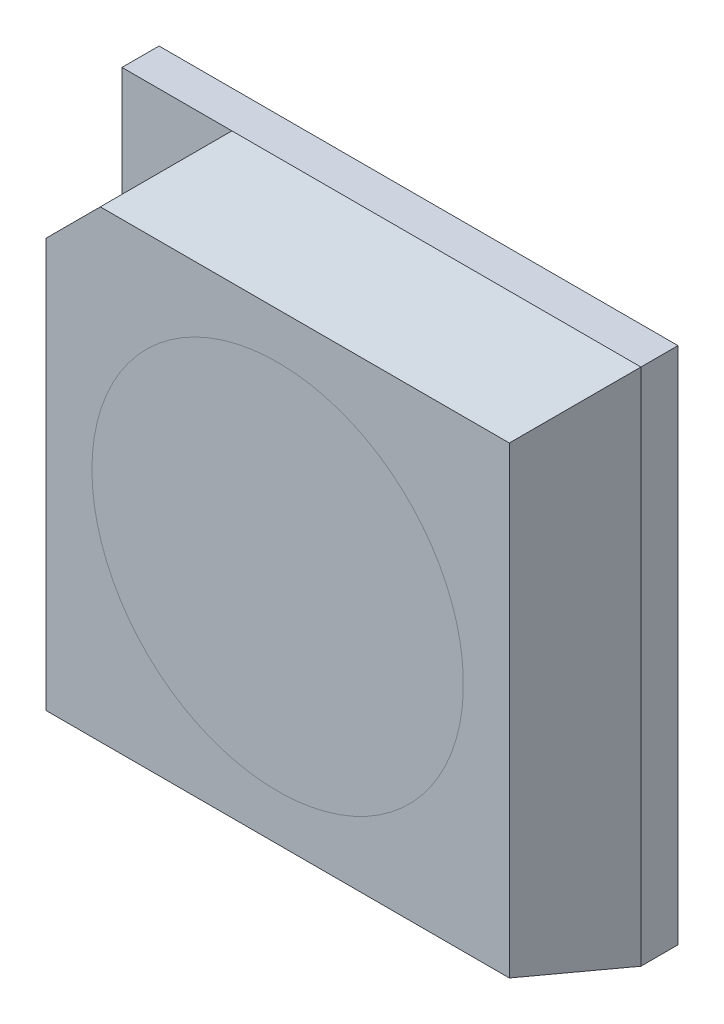
ISO-10303-21;
HEADER;
FILE_DESCRIPTION(('STEP AP214'),'2;1');
FILE_NAME('part.step','',(''),(''),'','','');
FILE_SCHEMA(('AUTOMOTIVE_DESIGN { 1 0 10303 214 1 1 1 1 }'));
ENDSEC;
DATA;
#1=APPLICATION_CONTEXT('core data for automotive mechanical design processes');
#2=APPLICATION_PROTOCOL_DEFINITION('international standard','automotive_design',2000,#1);
#3=PRODUCT_CONTEXT('',#1,'mechanical');
#4=PRODUCT('Part','Part','',(#3));
#5=PRODUCT_RELATED_PRODUCT_CATEGORY('part','',(#4));
#6=PRODUCT_DEFINITION_FORMATION('','',#4);
#7=PRODUCT_DEFINITION_CONTEXT('part definition',#1,'design');
#8=PRODUCT_DEFINITION('design','',#6,#7);
#9=PRODUCT_DEFINITION_SHAPE('','',#8);
#10=(LENGTH_UNIT() NAMED_UNIT(*) SI_UNIT(.MILLI.,.METRE.));
#11=(NAMED_UNIT(*) PLANE_ANGLE_UNIT() SI_UNIT($,.RADIAN.));
#12=(NAMED_UNIT(*) SI_UNIT($,.STERADIAN.) SOLID_ANGLE_UNIT());
#13=UNCERTAINTY_MEASURE_WITH_UNIT(LENGTH_MEASURE(1.E-05),#10,'distance_accuracy_value','');
#14=(GEOMETRIC_REPRESENTATION_CONTEXT(3) GLOBAL_UNCERTAINTY_ASSIGNED_CONTEXT((#13)) GLOBAL_UNIT_ASSIGNED_CONTEXT((#10,
#11,#12)) REPRESENTATION_CONTEXT('',''));
#15=CARTESIAN_POINT('',(0.,0.,0.));
#16=DIRECTION('',(0.,0.,1.));
#17=DIRECTION('',(1.,0.,0.));
#18=AXIS2_PLACEMENT_3D('',#15,#16,#17);
#19=CARTESIAN_POINT('',(0.566536214961577,0.166197507041943,0.25));
#20=DIRECTION('',(0.,0.,-1.));
#21=DIRECTION('',(-1.,0.,0.));
#22=AXIS2_PLACEMENT_3D('',#19,#20,#21);
#23=CYLINDRICAL_SURFACE('',#22,0.295340450420934);
#24=CARTESIAN_POINT('',(0.566536214961577,0.166197507041943,0.25));
#25=DIRECTION('',(0.,0.,1.));
#26=DIRECTION('',(1.,0.,0.));
#27=AXIS2_PLACEMENT_3D('',#24,#25,#26);
#28=CIRCLE('',#27,0.295340450420934);
#29=CARTESIAN_POINT('',(0.861876665382511,0.166197507041943,0.25));
#30=VERTEX_POINT('',#29);
#31=EDGE_CURVE('E13',#30,#30,#28,.T.);
#32=ORIENTED_EDGE('',*,*,#31,.F.);
#33=EDGE_LOOP('',(#32));
#34=FACE_BOUND('',#33,.T.);
#35=CARTESIAN_POINT('',(0.566536214961577,0.166197507041943,0.));
#36=DIRECTION('',(0.,0.,1.));
#37=DIRECTION('',(1.,0.,0.));
#38=AXIS2_PLACEMENT_3D('',#35,#36,#37);
#39=CIRCLE('',#38,0.295340450420934);
#40=CARTESIAN_POINT('',(0.861876665382511,0.166197507041943,0.));
#41=VERTEX_POINT('',#40);
#42=EDGE_CURVE('E259',#41,#41,#39,.T.);
#43=ORIENTED_EDGE('',*,*,#42,.T.);
#44=EDGE_LOOP('',(#43));
#45=FACE_BOUND('',#44,.T.);
#46=ADVANCED_FACE('F256',(#34,#45),#23,.T.);
#47=CARTESIAN_POINT('',(0.,0.,0.25));
#48=DIRECTION('',(0.,0.,1.));
#49=DIRECTION('',(1.,0.,0.));
#50=AXIS2_PLACEMENT_3D('',#47,#48,#49);
#51=PLANE('',#50);
#52=ORIENTED_EDGE('',*,*,#31,.T.);
#53=EDGE_LOOP('',(#52));
#54=FACE_BOUND('',#53,.T.);
#55=ADVANCED_FACE('F273',(#54),#51,.T.);
#56=CARTESIAN_POINT('',(0.,0.,0.));
#57=DIRECTION('',(0.,0.,1.));
#58=DIRECTION('',(1.,0.,0.));
#59=AXIS2_PLACEMENT_3D('',#56,#57,#58);
#60=PLANE('',#59);
#61=ORIENTED_EDGE('',*,*,#42,.F.);
#62=EDGE_LOOP('',(#61));
#63=FACE_BOUND('',#62,.T.);
#64=ADVANCED_FACE('F271',(#63),#60,.F.);
#65=CLOSED_SHELL('',(#46,#55,#64));
#66=MANIFOLD_SOLID_BREP('B2',#65);
#67=CARTESIAN_POINT('',(-0.428114095825549,-0.428013866610399,0.25));
#68=DIRECTION('',(0.,0.,-1.));
#69=DIRECTION('',(-1.,0.,0.));
#70=AXIS2_PLACEMENT_3D('',#67,#68,#69);
#71=CYLINDRICAL_SURFACE('',#70,0.338833711083453);
#72=CARTESIAN_POINT('',(-0.428114095825549,-0.428013866610399,0.25));
#73=DIRECTION('',(0.,0.,1.));
#74=DIRECTION('',(1.,0.,0.));
#75=AXIS2_PLACEMENT_3D('',#72,#73,#74);
#76=CIRCLE('',#75,0.338833711083453);
#77=CARTESIAN_POINT('',(-0.0892803847420964,-0.428013866610399,0.25));
#78=VERTEX_POINT('',#77);
#79=EDGE_CURVE('E255',#78,#78,#76,.T.);
#80=ORIENTED_EDGE('',*,*,#79,.F.);
#81=EDGE_LOOP('',(#80));
#82=FACE_BOUND('',#81,.T.);
#83=CARTESIAN_POINT('',(-0.428114095825549,-0.428013866610399,0.));
#84=DIRECTION('',(0.,0.,1.));
#85=DIRECTION('',(1.,0.,0.));
#86=AXIS2_PLACEMENT_3D('',#83,#84,#85);
#87=CIRCLE('',#86,0.338833711083453);
#88=CARTESIAN_POINT('',(-0.0892803847420964,-0.428013866610399,0.));
#89=VERTEX_POINT('',#88);
#90=EDGE_CURVE('E317',#89,#89,#87,.T.);
#91=ORIENTED_EDGE('',*,*,#90,.T.);
#92=EDGE_LOOP('',(#91));
#93=FACE_BOUND('',#92,.T.);
#94=ADVANCED_FACE('F314',(#82,#93),#71,.T.);
#95=CARTESIAN_POINT('',(0.,0.,0.25));
#96=DIRECTION('',(0.,0.,1.));
#97=DIRECTION('',(1.,0.,0.));
#98=AXIS2_PLACEMENT_3D('',#95,#96,#97);
#99=PLANE('',#98);
#100=ORIENTED_EDGE('',*,*,#79,.T.);
#101=EDGE_LOOP('',(#100));
#102=FACE_BOUND('',#101,.T.);
#103=ADVANCED_FACE('F331',(#102),#99,.T.);
#104=CARTESIAN_POINT('',(0.,0.,0.));
#105=DIRECTION('',(0.,0.,1.));
#106=DIRECTION('',(1.,0.,0.));
#107=AXIS2_PLACEMENT_3D('',#104,#105,#106);
#108=PLANE('',#107);
#109=ORIENTED_EDGE('',*,*,#90,.F.);
#110=EDGE_LOOP('',(#109));
#111=FACE_BOUND('',#110,.T.);
#112=ADVANCED_FACE('F329',(#111),#108,.F.);
#113=CLOSED_SHELL('',(#94,#103,#112));
#114=MANIFOLD_SOLID_BREP('B8',#113);
#115=CARTESIAN_POINT('',(-0.483693502486958,0.600735588307089,0.25));
#116=DIRECTION('',(0.,0.,-1.));
#117=DIRECTION('',(-1.,0.,0.));
#118=AXIS2_PLACEMENT_3D('',#115,#116,#117);
#119=CYLINDRICAL_SURFACE('',#118,0.240285244372317);
#120=CARTESIAN_POINT('',(-0.483693502486958,0.600735588307089,0.25));
#121=DIRECTION('',(0.,0.,1.));
#122=DIRECTION('',(1.,0.,0.));
#123=AXIS2_PLACEMENT_3D('',#120,#121,#122);
#124=CIRCLE('',#123,0.240285244372317);
#125=CARTESIAN_POINT('',(-0.243408258114641,0.600735588307089,0.25));
#126=VERTEX_POINT('',#125);
#127=EDGE_CURVE('E313',#126,#126,#124,.T.);
#128=ORIENTED_EDGE('',*,*,#127,.F.);
#129=EDGE_LOOP('',(#128));
#130=FACE_BOUND('',#129,.T.);
#131=CARTESIAN_POINT('',(-0.483693502486958,0.600735588307089,0.));
#132=DIRECTION('',(0.,0.,1.));
#133=DIRECTION('',(1.,0.,0.));
#134=AXIS2_PLACEMENT_3D('',#131,#132,#133);
#135=CIRCLE('',#134,0.240285244372317);
#136=CARTESIAN_POINT('',(-0.243408258114641,0.600735588307089,0.));
#137=VERTEX_POINT('',#136);
#138=EDGE_CURVE('E377',#137,#137,#135,.T.);
#139=ORIENTED_EDGE('',*,*,#138,.T.);
#140=EDGE_LOOP('',(#139));
#141=FACE_BOUND('',#140,.T.);
#142=ADVANCED_FACE('F374',(#130,#141),#119,.T.);
#143=CARTESIAN_POINT('',(0.,0.,0.25));
#144=DIRECTION('',(0.,0.,1.));
#145=DIRECTION('',(1.,0.,0.));
#146=AXIS2_PLACEMENT_3D('',#143,#144,#145);
#147=PLANE('',#146);
#148=ORIENTED_EDGE('',*,*,#127,.T.);
#149=EDGE_LOOP('',(#148));
#150=FACE_BOUND('',#149,.T.);
#151=ADVANCED_FACE('F391',(#150),#147,.T.);
#152=CARTESIAN_POINT('',(0.,0.,0.));
#153=DIRECTION('',(0.,0.,1.));
#154=DIRECTION('',(1.,0.,0.));
#155=AXIS2_PLACEMENT_3D('',#152,#153,#154);
#156=PLANE('',#155);
#157=ORIENTED_EDGE('',*,*,#138,.F.);
#158=EDGE_LOOP('',(#157));
#159=FACE_BOUND('',#158,.T.);
#160=ADVANCED_FACE('F389',(#159),#156,.F.);
#161=CLOSED_SHELL('',(#142,#151,#160));
#162=MANIFOLD_SOLID_BREP('B250',#161);
#163=CARTESIAN_POINT('',(1.36773941373576,0.,0.25));
#164=DIRECTION('',(-1.,0.,0.));
#165=DIRECTION('',(0.,-1.,0.));
#166=AXIS2_PLACEMENT_3D('',#163,#164,#165);
#167=PLANE('',#166);
#168=DIRECTION('',(0.,1.,0.));
#169=VECTOR('',#168,1.);
#170=CARTESIAN_POINT('',(1.36773941373576,0.,0.));
#171=LINE('',#170,#169);
#172=CARTESIAN_POINT('',(1.36773941373576,-0.566536214961578,0.));
#173=VERTEX_POINT('',#172);
#174=CARTESIAN_POINT('',(1.36773941373576,0.566536214961577,0.));
#175=VERTEX_POINT('',#174);
#176=EDGE_CURVE('E620',#173,#175,#171,.T.);
#177=ORIENTED_EDGE('',*,*,#176,.T.);
#178=DIRECTION('',(0.,0.,-1.));
#179=VECTOR('',#178,1.);
#180=CARTESIAN_POINT('',(1.36773941373576,0.566536214961577,0.25));
#181=LINE('',#180,#179);
#182=CARTESIAN_POINT('',(1.36773941373576,0.566536214961577,0.25));
#183=VERTEX_POINT('',#182);
#184=EDGE_CURVE('E372',#183,#175,#181,.T.);
#185=ORIENTED_EDGE('',*,*,#184,.F.);
#186=DIRECTION('',(0.,1.,0.));
#187=VECTOR('',#186,1.);
#188=CARTESIAN_POINT('',(1.36773941373576,0.,0.25));
#189=LINE('',#188,#187);
#190=CARTESIAN_POINT('',(1.36773941373576,-0.566536214961578,0.25));
#191=VERTEX_POINT('',#190);
#192=EDGE_CURVE('E726',#191,#183,#189,.T.);
#193=ORIENTED_EDGE('',*,*,#192,.F.);
#194=DIRECTION('',(0.,0.,-1.));
#195=VECTOR('',#194,1.);
#196=CARTESIAN_POINT('',(1.36773941373576,-0.566536214961578,0.25));
#197=LINE('',#196,#195);
#198=EDGE_CURVE('E643',#191,#173,#197,.T.);
#199=ORIENTED_EDGE('',*,*,#198,.T.);
#200=EDGE_LOOP('',(#177,#185,#193,#199));
#201=FACE_BOUND('',#200,.T.);
#202=ADVANCED_FACE('F434',(#201),#167,.F.);
#203=CARTESIAN_POINT('',(0.967137814348668,0.967137814348668,0.25));
#204=DIRECTION('',(-0.707106781186547,-0.707106781186548,0.));
#205=DIRECTION('',(0.707106781186548,-0.707106781186547,0.));
#206=AXIS2_PLACEMENT_3D('',#203,#204,#205);
#207=PLANE('',#206);
#208=DIRECTION('',(-0.707106781186548,0.707106781186547,0.));
#209=VECTOR('',#208,1.);
#210=CARTESIAN_POINT('',(0.967137814348668,0.967137814348668,0.));
#211=LINE('',#210,#209);
#212=CARTESIAN_POINT('',(0.566536214961577,1.36773941373576,0.));
#213=VERTEX_POINT('',#212);
#214=EDGE_CURVE('E624',#175,#213,#211,.T.);
#215=ORIENTED_EDGE('',*,*,#214,.T.);
#216=DIRECTION('',(0.,0.,-1.));
#217=VECTOR('',#216,1.);
#218=CARTESIAN_POINT('',(0.566536214961577,1.36773941373576,0.25));
#219=LINE('',#218,#217);
#220=CARTESIAN_POINT('',(0.566536214961577,1.36773941373576,0.25));
#221=VERTEX_POINT('',#220);
#222=EDGE_CURVE('E445',#221,#213,#219,.T.);
#223=ORIENTED_EDGE('',*,*,#222,.F.);
#224=DIRECTION('',(-0.707106781186548,0.707106781186547,0.));
#225=VECTOR('',#224,1.);
#226=CARTESIAN_POINT('',(0.967137814348668,0.967137814348668,0.25));
#227=LINE('',#226,#225);
#228=EDGE_CURVE('E728',#183,#221,#227,.T.);
#229=ORIENTED_EDGE('',*,*,#228,.F.);
#230=ORIENTED_EDGE('',*,*,#184,.T.);
#231=EDGE_LOOP('',(#215,#223,#229,#230));
#232=FACE_BOUND('',#231,.T.);
#233=ADVANCED_FACE('F767',(#232),#207,.F.);
#234=CARTESIAN_POINT('',(0.,1.36773941373576,0.25));
#235=DIRECTION('',(0.,-1.,0.));
#236=DIRECTION('',(0.,0.,-1.));
#237=AXIS2_PLACEMENT_3D('',#234,#235,#236);
#238=PLANE('',#237);
#239=DIRECTION('',(-1.,0.,0.));
#240=VECTOR('',#239,1.);
#241=CARTESIAN_POINT('',(0.,1.36773941373576,0.));
#242=LINE('',#241,#240);
#243=CARTESIAN_POINT('',(-0.566536214961578,1.36773941373576,0.));
#244=VERTEX_POINT('',#243);
#245=EDGE_CURVE('E627',#213,#244,#242,.T.);
#246=ORIENTED_EDGE('',*,*,#245,.T.);
#247=DIRECTION('',(0.,0.,-1.));
#248=VECTOR('',#247,1.);
#249=CARTESIAN_POINT('',(-0.566536214961578,1.36773941373576,0.25));
#250=LINE('',#249,#248);
#251=CARTESIAN_POINT('',(-0.566536214961578,1.36773941373576,0.25));
#252=VERTEX_POINT('',#251);
#253=EDGE_CURVE('E654',#252,#244,#250,.T.);
#254=ORIENTED_EDGE('',*,*,#253,.F.);
#255=DIRECTION('',(-1.,0.,0.));
#256=VECTOR('',#255,1.);
#257=CARTESIAN_POINT('',(0.,1.36773941373576,0.25));
#258=LINE('',#257,#256);
#259=EDGE_CURVE('E731',#221,#252,#258,.T.);
#260=ORIENTED_EDGE('',*,*,#259,.F.);
#261=ORIENTED_EDGE('',*,*,#222,.T.);
#262=EDGE_LOOP('',(#246,#254,#260,#261));
#263=FACE_BOUND('',#262,.T.);
#264=ADVANCED_FACE('F772',(#263),#238,.F.);
#265=CARTESIAN_POINT('',(-0.967137814348668,0.967137814348668,0.25));
#266=DIRECTION('',(0.707106781186548,-0.707106781186547,0.));
#267=DIRECTION('',(0.707106781186547,0.707106781186548,0.));
#268=AXIS2_PLACEMENT_3D('',#265,#266,#267);
#269=PLANE('',#268);
#270=DIRECTION('',(-0.707106781186547,-0.707106781186548,0.));
#271=VECTOR('',#270,1.);
#272=CARTESIAN_POINT('',(-0.967137814348668,0.967137814348668,0.));
#273=LINE('',#272,#271);
#274=CARTESIAN_POINT('',(-1.36773941373576,0.566536214961577,0.));
#275=VERTEX_POINT('',#274);
#276=EDGE_CURVE('E630',#244,#275,#273,.T.);
#277=ORIENTED_EDGE('',*,*,#276,.T.);
#278=DIRECTION('',(0.,0.,-1.));
#279=VECTOR('',#278,1.);
#280=CARTESIAN_POINT('',(-1.36773941373576,0.566536214961577,0.25));
#281=LINE('',#280,#279);
#282=CARTESIAN_POINT('',(-1.36773941373576,0.566536214961577,0.25));
#283=VERTEX_POINT('',#282);
#284=EDGE_CURVE('E650',#283,#275,#281,.T.);
#285=ORIENTED_EDGE('',*,*,#284,.F.);
#286=DIRECTION('',(-0.707106781186547,-0.707106781186548,0.));
#287=VECTOR('',#286,1.);
#288=CARTESIAN_POINT('',(-0.967137814348668,0.967137814348668,0.25));
#289=LINE('',#288,#287);
#290=EDGE_CURVE('E734',#252,#283,#289,.T.);
#291=ORIENTED_EDGE('',*,*,#290,.F.);
#292=ORIENTED_EDGE('',*,*,#253,.T.);
#293=EDGE_LOOP('',(#277,#285,#291,#292));
#294=FACE_BOUND('',#293,.T.);
#295=ADVANCED_FACE('F742',(#294),#269,.F.);
#296=CARTESIAN_POINT('',(-1.36773941373576,0.,0.25));
#297=DIRECTION('',(1.,0.,0.));
#298=DIRECTION('',(0.,1.,0.));
#299=AXIS2_PLACEMENT_3D('',#296,#297,#298);
#300=PLANE('',#299);
#301=DIRECTION('',(0.,-1.,0.));
#302=VECTOR('',#301,1.);
#303=CARTESIAN_POINT('',(-1.36773941373576,0.,0.));
#304=LINE('',#303,#302);
#305=CARTESIAN_POINT('',(-1.36773941373576,-0.566536214961578,0.));
#306=VERTEX_POINT('',#305);
#307=EDGE_CURVE('E633',#275,#306,#304,.T.);
#308=ORIENTED_EDGE('',*,*,#307,.T.);
#309=DIRECTION('',(0.,0.,-1.));
#310=VECTOR('',#309,1.);
#311=CARTESIAN_POINT('',(-1.36773941373576,-0.566536214961578,0.25));
#312=LINE('',#311,#310);
#313=CARTESIAN_POINT('',(-1.36773941373576,-0.566536214961578,0.25));
#314=VERTEX_POINT('',#313);
#315=EDGE_CURVE('E576',#314,#306,#312,.T.);
#316=ORIENTED_EDGE('',*,*,#315,.F.);
#317=DIRECTION('',(0.,-1.,0.));
#318=VECTOR('',#317,1.);
#319=CARTESIAN_POINT('',(-1.36773941373576,0.,0.25));
#320=LINE('',#319,#318);
#321=EDGE_CURVE('E565',#283,#314,#320,.T.);
#322=ORIENTED_EDGE('',*,*,#321,.F.);
#323=ORIENTED_EDGE('',*,*,#284,.T.);
#324=EDGE_LOOP('',(#308,#316,#322,#323));
#325=FACE_BOUND('',#324,.T.);
#326=ADVANCED_FACE('F746',(#325),#300,.F.);
#327=CARTESIAN_POINT('',(-0.967137814348668,-0.967137814348668,0.25));
#328=DIRECTION('',(0.707106781186547,0.707106781186548,0.));
#329=DIRECTION('',(-0.707106781186548,0.707106781186547,0.));
#330=AXIS2_PLACEMENT_3D('',#327,#328,#329);
#331=PLANE('',#330);
#332=DIRECTION('',(0.707106781186548,-0.707106781186547,0.));
#333=VECTOR('',#332,1.);
#334=CARTESIAN_POINT('',(-0.967137814348668,-0.967137814348668,0.));
#335=LINE('',#334,#333);
#336=CARTESIAN_POINT('',(-0.566536214961576,-1.36773941373576,0.));
#337=VERTEX_POINT('',#336);
#338=EDGE_CURVE('E574',#306,#337,#335,.T.);
#339=ORIENTED_EDGE('',*,*,#338,.T.);
#340=DIRECTION('',(0.,0.,-1.));
#341=VECTOR('',#340,1.);
#342=CARTESIAN_POINT('',(-0.566536214961576,-1.36773941373576,0.25));
#343=LINE('',#342,#341);
#344=CARTESIAN_POINT('',(-0.566536214961576,-1.36773941373576,0.25));
#345=VERTEX_POINT('',#344);
#346=EDGE_CURVE('E571',#345,#337,#343,.T.);
#347=ORIENTED_EDGE('',*,*,#346,.F.);
#348=DIRECTION('',(0.707106781186548,-0.707106781186547,0.));
#349=VECTOR('',#348,1.);
#350=CARTESIAN_POINT('',(-0.967137814348668,-0.967137814348668,0.25));
#351=LINE('',#350,#349);
#352=EDGE_CURVE('E559',#314,#345,#351,.T.);
#353=ORIENTED_EDGE('',*,*,#352,.F.);
#354=ORIENTED_EDGE('',*,*,#315,.T.);
#355=EDGE_LOOP('',(#339,#347,#353,#354));
#356=FACE_BOUND('',#355,.T.);
#357=ADVANCED_FACE('F572',(#356),#331,.F.);
#358=CARTESIAN_POINT('',(0.,-1.36773941373576,0.25));
#359=DIRECTION('',(0.,1.,0.));
#360=DIRECTION('',(-1.,0.,0.));
#361=AXIS2_PLACEMENT_3D('',#358,#359,#360);
#362=PLANE('',#361);
#363=DIRECTION('',(1.,0.,0.));
#364=VECTOR('',#363,1.);
#365=CARTESIAN_POINT('',(0.,-1.36773941373576,0.));
#366=LINE('',#365,#364);
#367=CARTESIAN_POINT('',(0.566536214961578,-1.36773941373576,0.));
#368=VERTEX_POINT('',#367);
#369=EDGE_CURVE('E507',#337,#368,#366,.T.);
#370=ORIENTED_EDGE('',*,*,#369,.T.);
#371=DIRECTION('',(0.,0.,-1.));
#372=VECTOR('',#371,1.);
#373=CARTESIAN_POINT('',(0.566536214961578,-1.36773941373576,0.25));
#374=LINE('',#373,#372);
#375=CARTESIAN_POINT('',(0.566536214961578,-1.36773941373576,0.25));
#376=VERTEX_POINT('',#375);
#377=EDGE_CURVE('E577',#376,#368,#374,.T.);
#378=ORIENTED_EDGE('',*,*,#377,.F.);
#379=DIRECTION('',(1.,0.,0.));
#380=VECTOR('',#379,1.);
#381=CARTESIAN_POINT('',(0.,-1.36773941373576,0.25));
#382=LINE('',#381,#380);
#383=EDGE_CURVE('E563',#345,#376,#382,.T.);
#384=ORIENTED_EDGE('',*,*,#383,.F.);
#385=ORIENTED_EDGE('',*,*,#346,.T.);
#386=EDGE_LOOP('',(#370,#378,#384,#385));
#387=FACE_BOUND('',#386,.T.);
#388=ADVANCED_FACE('F579',(#387),#362,.F.);
#389=CARTESIAN_POINT('',(0.825716458111358,0.825716458111359,0.25));
#390=DIRECTION('',(-0.707106781186547,-0.707106781186548,0.));
#391=DIRECTION('',(0.707106781186548,-0.707106781186547,0.));
#392=AXIS2_PLACEMENT_3D('',#389,#390,#391);
#393=PLANE('',#392);
#394=DIRECTION('',(-0.707106781186548,0.707106781186547,0.));
#395=VECTOR('',#394,1.);
#396=CARTESIAN_POINT('',(0.825716458111358,0.825716458111359,0.));
#397=LINE('',#396,#395);
#398=CARTESIAN_POINT('',(1.16773941373576,0.483693502486958,0.));
#399=VERTEX_POINT('',#398);
#400=CARTESIAN_POINT('',(0.483693502486958,1.16773941373576,0.));
#401=VERTEX_POINT('',#400);
#402=EDGE_CURVE('E589',#399,#401,#397,.T.);
#403=ORIENTED_EDGE('',*,*,#402,.F.);
#404=DIRECTION('',(0.,0.,-1.));
#405=VECTOR('',#404,1.);
#406=CARTESIAN_POINT('',(1.16773941373576,0.483693502486958,0.25));
#407=LINE('',#406,#405);
#408=CARTESIAN_POINT('',(1.16773941373576,0.483693502486958,0.25));
#409=VERTEX_POINT('',#408);
#410=EDGE_CURVE('E438',#409,#399,#407,.T.);
#411=ORIENTED_EDGE('',*,*,#410,.F.);
#412=DIRECTION('',(-0.707106781186548,0.707106781186547,0.));
#413=VECTOR('',#412,1.);
#414=CARTESIAN_POINT('',(0.825716458111358,0.825716458111359,0.25));
#415=LINE('',#414,#413);
#416=CARTESIAN_POINT('',(0.483693502486958,1.16773941373576,0.25));
#417=VERTEX_POINT('',#416);
#418=EDGE_CURVE('E642',#409,#417,#415,.T.);
#419=ORIENTED_EDGE('',*,*,#418,.T.);
#420=DIRECTION('',(0.,0.,-1.));
#421=VECTOR('',#420,1.);
#422=CARTESIAN_POINT('',(0.483693502486958,1.16773941373576,0.25));
#423=LINE('',#422,#421);
#424=EDGE_CURVE('E585',#417,#401,#423,.T.);
#425=ORIENTED_EDGE('',*,*,#424,.T.);
#426=EDGE_LOOP('',(#403,#411,#419,#425));
#427=FACE_BOUND('',#426,.T.);
#428=ADVANCED_FACE('F436',(#427),#393,.T.);
#429=CARTESIAN_POINT('',(1.16773941373576,0.,0.25));
#430=DIRECTION('',(-1.,0.,0.));
#431=DIRECTION('',(0.,0.,1.));
#432=AXIS2_PLACEMENT_3D('',#429,#430,#431);
#433=PLANE('',#432);
#434=DIRECTION('',(0.,1.,0.));
#435=VECTOR('',#434,1.);
#436=CARTESIAN_POINT('',(1.16773941373576,0.,0.));
#437=LINE('',#436,#435);
#438=CARTESIAN_POINT('',(1.16773941373576,-0.483693502486959,0.));
#439=VERTEX_POINT('',#438);
#440=EDGE_CURVE('E593',#439,#399,#437,.T.);
#441=ORIENTED_EDGE('',*,*,#440,.F.);
#442=DIRECTION('',(0.,0.,-1.));
#443=VECTOR('',#442,1.);
#444=CARTESIAN_POINT('',(1.16773941373576,-0.483693502486959,0.25));
#445=LINE('',#444,#443);
#446=CARTESIAN_POINT('',(1.16773941373576,-0.483693502486959,0.25));
#447=VERTEX_POINT('',#446);
#448=EDGE_CURVE('E677',#447,#439,#445,.T.);
#449=ORIENTED_EDGE('',*,*,#448,.F.);
#450=DIRECTION('',(0.,1.,0.));
#451=VECTOR('',#450,1.);
#452=CARTESIAN_POINT('',(1.16773941373576,0.,0.25));
#453=LINE('',#452,#451);
#454=EDGE_CURVE('E688',#447,#409,#453,.T.);
#455=ORIENTED_EDGE('',*,*,#454,.T.);
#456=ORIENTED_EDGE('',*,*,#410,.T.);
#457=EDGE_LOOP('',(#441,#449,#455,#456));
#458=FACE_BOUND('',#457,.T.);
#459=ADVANCED_FACE('F686',(#458),#433,.T.);
#460=CARTESIAN_POINT('',(0.825716458111359,-0.825716458111359,0.25));
#461=DIRECTION('',(-0.707106781186548,0.707106781186547,0.));
#462=DIRECTION('',(-0.707106781186547,-0.707106781186548,0.));
#463=AXIS2_PLACEMENT_3D('',#460,#461,#462);
#464=PLANE('',#463);
#465=DIRECTION('',(0.707106781186547,0.707106781186548,0.));
#466=VECTOR('',#465,1.);
#467=CARTESIAN_POINT('',(0.825716458111359,-0.825716458111359,0.));
#468=LINE('',#467,#466);
#469=CARTESIAN_POINT('',(0.483693502486959,-1.16773941373576,0.));
#470=VERTEX_POINT('',#469);
#471=EDGE_CURVE('E597',#470,#439,#468,.T.);
#472=ORIENTED_EDGE('',*,*,#471,.F.);
#473=DIRECTION('',(0.,0.,-1.));
#474=VECTOR('',#473,1.);
#475=CARTESIAN_POINT('',(0.483693502486959,-1.16773941373576,0.25));
#476=LINE('',#475,#474);
#477=CARTESIAN_POINT('',(0.483693502486959,-1.16773941373576,0.25));
#478=VERTEX_POINT('',#477);
#479=EDGE_CURVE('E675',#478,#470,#476,.T.);
#480=ORIENTED_EDGE('',*,*,#479,.F.);
#481=DIRECTION('',(0.707106781186547,0.707106781186548,0.));
#482=VECTOR('',#481,1.);
#483=CARTESIAN_POINT('',(0.825716458111359,-0.825716458111359,0.25));
#484=LINE('',#483,#482);
#485=EDGE_CURVE('E696',#478,#447,#484,.T.);
#486=ORIENTED_EDGE('',*,*,#485,.T.);
#487=ORIENTED_EDGE('',*,*,#448,.T.);
#488=EDGE_LOOP('',(#472,#480,#486,#487));
#489=FACE_BOUND('',#488,.T.);
#490=ADVANCED_FACE('F694',(#489),#464,.T.);
#491=CARTESIAN_POINT('',(0.,-1.16773941373576,0.25));
#492=DIRECTION('',(0.,1.,0.));
#493=DIRECTION('',(-1.,0.,0.));
#494=AXIS2_PLACEMENT_3D('',#491,#492,#493);
#495=PLANE('',#494);
#496=DIRECTION('',(1.,0.,0.));
#497=VECTOR('',#496,1.);
#498=CARTESIAN_POINT('',(0.,-1.16773941373576,0.));
#499=LINE('',#498,#497);
#500=CARTESIAN_POINT('',(-0.483693502486958,-1.16773941373576,0.));
#501=VERTEX_POINT('',#500);
#502=EDGE_CURVE('E601',#501,#470,#499,.T.);
#503=ORIENTED_EDGE('',*,*,#502,.F.);
#504=DIRECTION('',(0.,0.,-1.));
#505=VECTOR('',#504,1.);
#506=CARTESIAN_POINT('',(-0.483693502486958,-1.16773941373576,0.25));
#507=LINE('',#506,#505);
#508=CARTESIAN_POINT('',(-0.483693502486958,-1.16773941373576,0.25));
#509=VERTEX_POINT('',#508);
#510=EDGE_CURVE('E672',#509,#501,#507,.T.);
#511=ORIENTED_EDGE('',*,*,#510,.F.);
#512=DIRECTION('',(1.,0.,0.));
#513=VECTOR('',#512,1.);
#514=CARTESIAN_POINT('',(0.,-1.16773941373576,0.25));
#515=LINE('',#514,#513);
#516=EDGE_CURVE('E702',#509,#478,#515,.T.);
#517=ORIENTED_EDGE('',*,*,#516,.T.);
#518=ORIENTED_EDGE('',*,*,#479,.T.);
#519=EDGE_LOOP('',(#503,#511,#517,#518));
#520=FACE_BOUND('',#519,.T.);
#521=ADVANCED_FACE('F706',(#520),#495,.T.);
#522=CARTESIAN_POINT('',(-0.825716458111358,-0.825716458111359,0.25));
#523=DIRECTION('',(0.707106781186547,0.707106781186548,0.));
#524=DIRECTION('',(-0.707106781186548,0.707106781186547,0.));
#525=AXIS2_PLACEMENT_3D('',#522,#523,#524);
#526=PLANE('',#525);
#527=DIRECTION('',(0.707106781186548,-0.707106781186547,0.));
#528=VECTOR('',#527,1.);
#529=CARTESIAN_POINT('',(-0.825716458111358,-0.825716458111359,0.));
#530=LINE('',#529,#528);
#531=CARTESIAN_POINT('',(-1.16773941373576,-0.483693502486959,0.));
#532=VERTEX_POINT('',#531);
#533=EDGE_CURVE('E605',#532,#501,#530,.T.);
#534=ORIENTED_EDGE('',*,*,#533,.F.);
#535=DIRECTION('',(0.,0.,-1.));
#536=VECTOR('',#535,1.);
#537=CARTESIAN_POINT('',(-1.16773941373576,-0.483693502486959,0.25));
#538=LINE('',#537,#536);
#539=CARTESIAN_POINT('',(-1.16773941373576,-0.483693502486959,0.25));
#540=VERTEX_POINT('',#539);
#541=EDGE_CURVE('E669',#540,#532,#538,.T.);
#542=ORIENTED_EDGE('',*,*,#541,.F.);
#543=DIRECTION('',(0.707106781186548,-0.707106781186547,0.));
#544=VECTOR('',#543,1.);
#545=CARTESIAN_POINT('',(-0.825716458111358,-0.825716458111359,0.25));
#546=LINE('',#545,#544);
#547=EDGE_CURVE('E708',#540,#509,#546,.T.);
#548=ORIENTED_EDGE('',*,*,#547,.T.);
#549=ORIENTED_EDGE('',*,*,#510,.T.);
#550=EDGE_LOOP('',(#534,#542,#548,#549));
#551=FACE_BOUND('',#550,.T.);
#552=ADVANCED_FACE('F783',(#551),#526,.T.);
#553=CARTESIAN_POINT('',(-1.16773941373576,0.,0.25));
#554=DIRECTION('',(1.,0.,0.));
#555=DIRECTION('',(0.,1.,0.));
#556=AXIS2_PLACEMENT_3D('',#553,#554,#555);
#557=PLANE('',#556);
#558=DIRECTION('',(0.,-1.,0.));
#559=VECTOR('',#558,1.);
#560=CARTESIAN_POINT('',(-1.16773941373576,0.,0.));
#561=LINE('',#560,#559);
#562=CARTESIAN_POINT('',(-1.16773941373576,0.483693502486957,0.));
#563=VERTEX_POINT('',#562);
#564=EDGE_CURVE('E608',#563,#532,#561,.T.);
#565=ORIENTED_EDGE('',*,*,#564,.F.);
#566=DIRECTION('',(0.,0.,-1.));
#567=VECTOR('',#566,1.);
#568=CARTESIAN_POINT('',(-1.16773941373576,0.483693502486957,0.25));
#569=LINE('',#568,#567);
#570=CARTESIAN_POINT('',(-1.16773941373576,0.483693502486957,0.25));
#571=VERTEX_POINT('',#570);
#572=EDGE_CURVE('E666',#571,#563,#569,.T.);
#573=ORIENTED_EDGE('',*,*,#572,.F.);
#574=DIRECTION('',(0.,-1.,0.));
#575=VECTOR('',#574,1.);
#576=CARTESIAN_POINT('',(-1.16773941373576,0.,0.25));
#577=LINE('',#576,#575);
#578=EDGE_CURVE('E712',#571,#540,#577,.T.);
#579=ORIENTED_EDGE('',*,*,#578,.T.);
#580=ORIENTED_EDGE('',*,*,#541,.T.);
#581=EDGE_LOOP('',(#565,#573,#579,#580));
#582=FACE_BOUND('',#581,.T.);
#583=ADVANCED_FACE('F779',(#582),#557,.T.);
#584=CARTESIAN_POINT('',(-0.825716458111359,0.825716458111358,0.25));
#585=DIRECTION('',(0.707106781186548,-0.707106781186547,0.));
#586=DIRECTION('',(0.707106781186547,0.707106781186548,0.));
#587=AXIS2_PLACEMENT_3D('',#584,#585,#586);
#588=PLANE('',#587);
#589=DIRECTION('',(-0.707106781186547,-0.707106781186548,0.));
#590=VECTOR('',#589,1.);
#591=CARTESIAN_POINT('',(-0.825716458111359,0.825716458111358,0.));
#592=LINE('',#591,#590);
#593=CARTESIAN_POINT('',(-0.483693502486958,1.16773941373576,0.));
#594=VERTEX_POINT('',#593);
#595=EDGE_CURVE('E612',#594,#563,#592,.T.);
#596=ORIENTED_EDGE('',*,*,#595,.F.);
#597=DIRECTION('',(0.,0.,-1.));
#598=VECTOR('',#597,1.);
#599=CARTESIAN_POINT('',(-0.483693502486958,1.16773941373576,0.25));
#600=LINE('',#599,#598);
#601=CARTESIAN_POINT('',(-0.483693502486958,1.16773941373576,0.25));
#602=VERTEX_POINT('',#601);
#603=EDGE_CURVE('E663',#602,#594,#600,.T.);
#604=ORIENTED_EDGE('',*,*,#603,.F.);
#605=DIRECTION('',(-0.707106781186547,-0.707106781186548,0.));
#606=VECTOR('',#605,1.);
#607=CARTESIAN_POINT('',(-0.825716458111359,0.825716458111358,0.25));
#608=LINE('',#607,#606);
#609=EDGE_CURVE('E718',#602,#571,#608,.T.);
#610=ORIENTED_EDGE('',*,*,#609,.T.);
#611=ORIENTED_EDGE('',*,*,#572,.T.);
#612=EDGE_LOOP('',(#596,#604,#610,#611));
#613=FACE_BOUND('',#612,.T.);
#614=ADVANCED_FACE('F761',(#613),#588,.T.);
#615=CARTESIAN_POINT('',(0.,1.16773941373576,0.25));
#616=DIRECTION('',(0.,-1.,0.));
#617=DIRECTION('',(0.,0.,-1.));
#618=AXIS2_PLACEMENT_3D('',#615,#616,#617);
#619=PLANE('',#618);
#620=DIRECTION('',(-1.,0.,0.));
#621=VECTOR('',#620,1.);
#622=CARTESIAN_POINT('',(0.,1.16773941373576,0.));
#623=LINE('',#622,#621);
#624=EDGE_CURVE('E616',#401,#594,#623,.T.);
#625=ORIENTED_EDGE('',*,*,#624,.F.);
#626=ORIENTED_EDGE('',*,*,#424,.F.);
#627=DIRECTION('',(-1.,0.,0.));
#628=VECTOR('',#627,1.);
#629=CARTESIAN_POINT('',(0.,1.16773941373576,0.25));
#630=LINE('',#629,#628);
#631=EDGE_CURVE('E722',#417,#602,#630,.T.);
#632=ORIENTED_EDGE('',*,*,#631,.T.);
#633=ORIENTED_EDGE('',*,*,#603,.T.);
#634=EDGE_LOOP('',(#625,#626,#632,#633));
#635=FACE_BOUND('',#634,.T.);
#636=ADVANCED_FACE('F754',(#635),#619,.T.);
#637=CARTESIAN_POINT('',(0.967137814348669,-0.967137814348668,0.25));
#638=DIRECTION('',(-0.707106781186548,0.707106781186547,0.));
#639=DIRECTION('',(-0.707106781186547,-0.707106781186548,0.));
#640=AXIS2_PLACEMENT_3D('',#637,#638,#639);
#641=PLANE('',#640);
#642=DIRECTION('',(0.707106781186547,0.707106781186548,0.));
#643=VECTOR('',#642,1.);
#644=CARTESIAN_POINT('',(0.967137814348669,-0.967137814348668,0.));
#645=LINE('',#644,#643);
#646=EDGE_CURVE('E513',#368,#173,#645,.T.);
#647=ORIENTED_EDGE('',*,*,#646,.T.);
#648=ORIENTED_EDGE('',*,*,#198,.F.);
#649=DIRECTION('',(0.707106781186547,0.707106781186548,0.));
#650=VECTOR('',#649,1.);
#651=CARTESIAN_POINT('',(0.967137814348669,-0.967137814348668,0.25));
#652=LINE('',#651,#650);
#653=EDGE_CURVE('E454',#376,#191,#652,.T.);
#654=ORIENTED_EDGE('',*,*,#653,.F.);
#655=ORIENTED_EDGE('',*,*,#377,.T.);
#656=EDGE_LOOP('',(#647,#648,#654,#655));
#657=FACE_BOUND('',#656,.T.);
#658=ADVANCED_FACE('F752',(#657),#641,.F.);
#659=CARTESIAN_POINT('',(0.,0.,0.25));
#660=DIRECTION('',(0.,0.,1.));
#661=DIRECTION('',(1.,0.,0.));
#662=AXIS2_PLACEMENT_3D('',#659,#660,#661);
#663=PLANE('',#662);
#664=ORIENTED_EDGE('',*,*,#418,.F.);
#665=ORIENTED_EDGE('',*,*,#454,.F.);
#666=ORIENTED_EDGE('',*,*,#485,.F.);
#667=ORIENTED_EDGE('',*,*,#516,.F.);
#668=ORIENTED_EDGE('',*,*,#547,.F.);
#669=ORIENTED_EDGE('',*,*,#578,.F.);
#670=ORIENTED_EDGE('',*,*,#609,.F.);
#671=ORIENTED_EDGE('',*,*,#631,.F.);
#672=EDGE_LOOP('',(#664,#665,#666,#667,#668,#669,#670,#671));
#673=FACE_BOUND('',#672,.T.);
#674=ORIENTED_EDGE('',*,*,#192,.T.);
#675=ORIENTED_EDGE('',*,*,#228,.T.);
#676=ORIENTED_EDGE('',*,*,#259,.T.);
#677=ORIENTED_EDGE('',*,*,#290,.T.);
#678=ORIENTED_EDGE('',*,*,#321,.T.);
#679=ORIENTED_EDGE('',*,*,#352,.T.);
#680=ORIENTED_EDGE('',*,*,#383,.T.);
#681=ORIENTED_EDGE('',*,*,#653,.T.);
#682=EDGE_LOOP('',(#674,#675,#676,#677,#678,#679,#680,#681));
#683=FACE_BOUND('',#682,.T.);
#684=ADVANCED_FACE('F561',(#673,#683),#663,.T.);
#685=CARTESIAN_POINT('',(0.,0.,0.));
#686=DIRECTION('',(0.,0.,1.));
#687=DIRECTION('',(1.,0.,0.));
#688=AXIS2_PLACEMENT_3D('',#685,#686,#687);
#689=PLANE('',#688);
#690=ORIENTED_EDGE('',*,*,#402,.T.);
#691=ORIENTED_EDGE('',*,*,#624,.T.);
#692=ORIENTED_EDGE('',*,*,#595,.T.);
#693=ORIENTED_EDGE('',*,*,#564,.T.);
#694=ORIENTED_EDGE('',*,*,#533,.T.);
#695=ORIENTED_EDGE('',*,*,#502,.T.);
#696=ORIENTED_EDGE('',*,*,#471,.T.);
#697=ORIENTED_EDGE('',*,*,#440,.T.);
#698=EDGE_LOOP('',(#690,#691,#692,#693,#694,#695,#696,#697));
#699=FACE_BOUND('',#698,.T.);
#700=ORIENTED_EDGE('',*,*,#176,.F.);
#701=ORIENTED_EDGE('',*,*,#646,.F.);
#702=ORIENTED_EDGE('',*,*,#369,.F.);
#703=ORIENTED_EDGE('',*,*,#338,.F.);
#704=ORIENTED_EDGE('',*,*,#307,.F.);
#705=ORIENTED_EDGE('',*,*,#276,.F.);
#706=ORIENTED_EDGE('',*,*,#245,.F.);
#707=ORIENTED_EDGE('',*,*,#214,.F.);
#708=EDGE_LOOP('',(#700,#701,#702,#703,#704,#705,#706,#707));
#709=FACE_BOUND('',#708,.T.);
#710=ADVANCED_FACE('F691',(#699,#709),#689,.F.);
#711=CLOSED_SHELL('',(#202,#233,#264,#295,#326,#357,#388,#428,#459,#490,#521,#552,#583,#614,
#636,#658,#684,#710));
#712=MANIFOLD_SOLID_BREP('B308',#711);
#713=CARTESIAN_POINT('',(0.,0.,0.7));
#714=DIRECTION('',(0.,0.,-1.));
#715=DIRECTION('',(-1.,0.,0.));
#716=AXIS2_PLACEMENT_3D('',#713,#714,#715);
#717=PLANE('',#716);
#718=CARTESIAN_POINT('',(0.,0.,0.7));
#719=DIRECTION('',(0.,0.,-1.));
#720=DIRECTION('',(-1.,0.,0.));
#721=AXIS2_PLACEMENT_3D('',#718,#719,#720);
#722=CIRCLE('',#721,1.25263344863924);
#723=CARTESIAN_POINT('',(-1.25263344863924,0.,0.7));
#724=VERTEX_POINT('',#723);
#725=EDGE_CURVE('E432',#724,#724,#722,.F.);
#726=ORIENTED_EDGE('',*,*,#725,.T.);
#727=EDGE_LOOP('',(#726));
#728=FACE_BOUND('',#727,.T.);
#729=ADVANCED_FACE('F947',(#728),#717,.F.);
#730=CARTESIAN_POINT('',(-1.75,1.75,0.));
#731=DIRECTION('',(0.,0.965925826289068,0.258819045102521));
#732=DIRECTION('',(0.,-0.258819045102521,0.965925826289068));
#733=AXIS2_PLACEMENT_3D('',#730,#731,#732);
#734=PLANE('',#733);
#735=DIRECTION('',(-0.250562807085729,-0.250562807085732,0.93511312653103));
#736=VECTOR('',#735,1.);
#737=CARTESIAN_POINT('',(-1.05511587098754,1.70345158969948,0.173721032253114));
#738=LINE('',#737,#736);
#739=CARTESIAN_POINT('',(-1.1961318953888,1.56243556529821,0.7));
#740=VERTEX_POINT('',#739);
#741=CARTESIAN_POINT('',(-1.00856746068701,1.75,0.));
#742=VERTEX_POINT('',#741);
#743=EDGE_CURVE('E963',#740,#742,#738,.F.);
#744=ORIENTED_EDGE('',*,*,#743,.F.);
#745=DIRECTION('',(1.,0.,0.));
#746=VECTOR('',#745,1.);
#747=CARTESIAN_POINT('',(0.,1.56243556529821,0.7));
#748=LINE('',#747,#746);
#749=CARTESIAN_POINT('',(1.56243556529821,1.56243556529821,0.7));
#750=VERTEX_POINT('',#749);
#751=EDGE_CURVE('E1041',#750,#740,#748,.F.);
#752=ORIENTED_EDGE('',*,*,#751,.F.);
#753=DIRECTION('',(0.250562807085732,0.250562807085732,-0.935113126531029));
#754=VECTOR('',#753,1.);
#755=CARTESIAN_POINT('',(1.53026397896861,1.53026397896861,0.820065994742155));
#756=LINE('',#755,#754);
#757=CARTESIAN_POINT('',(1.75,1.75,0.));
#758=VERTEX_POINT('',#757);
#759=EDGE_CURVE('E956',#750,#758,#756,.T.);
#760=ORIENTED_EDGE('',*,*,#759,.T.);
#761=DIRECTION('',(-1.,0.,0.));
#762=VECTOR('',#761,1.);
#763=CARTESIAN_POINT('',(-1.75,1.75,0.));
#764=LINE('',#763,#762);
#765=EDGE_CURVE('E1018',#758,#742,#764,.T.);
#766=ORIENTED_EDGE('',*,*,#765,.T.);
#767=EDGE_LOOP('',(#744,#752,#760,#766));
#768=FACE_BOUND('',#767,.T.);
#769=ADVANCED_FACE('F949',(#768),#734,.T.);
#770=CARTESIAN_POINT('',(-1.75,-1.75,0.));
#771=DIRECTION('',(-0.965925826289068,0.,0.258819045102521));
#772=DIRECTION('',(0.258819045102521,0.,0.965925826289068));
#773=AXIS2_PLACEMENT_3D('',#770,#771,#772);
#774=PLANE('',#773);
#775=DIRECTION('',(-0.250562807085732,-0.250562807085735,-0.935113126531028));
#776=VECTOR('',#775,1.);
#777=CARTESIAN_POINT('',(-1.92318761073086,0.835379849956138,-0.646344962489043));
#778=LINE('',#777,#776);
#779=CARTESIAN_POINT('',(-1.75,1.008567460687,0.));
#780=VERTEX_POINT('',#779);
#781=CARTESIAN_POINT('',(-1.56243556529821,1.19613189538879,0.7));
#782=VERTEX_POINT('',#781);
#783=EDGE_CURVE('E996',#780,#782,#778,.F.);
#784=ORIENTED_EDGE('',*,*,#783,.F.);
#785=DIRECTION('',(0.,-1.,0.));
#786=VECTOR('',#785,1.);
#787=CARTESIAN_POINT('',(-1.75,-1.75,0.));
#788=LINE('',#787,#786);
#789=CARTESIAN_POINT('',(-1.75,-1.75,0.));
#790=VERTEX_POINT('',#789);
#791=EDGE_CURVE('E1008',#780,#790,#788,.T.);
#792=ORIENTED_EDGE('',*,*,#791,.T.);
#793=DIRECTION('',(-0.250562807085732,-0.250562807085732,-0.935113126531029));
#794=VECTOR('',#793,1.);
#795=CARTESIAN_POINT('',(-1.75,-1.75,0.));
#796=LINE('',#795,#794);
#797=CARTESIAN_POINT('',(-1.56243556529821,-1.56243556529821,0.7));
#798=VERTEX_POINT('',#797);
#799=EDGE_CURVE('E1032',#798,#790,#796,.T.);
#800=ORIENTED_EDGE('',*,*,#799,.F.);
#801=DIRECTION('',(0.,1.,0.));
#802=VECTOR('',#801,1.);
#803=CARTESIAN_POINT('',(-1.56243556529821,0.,0.7));
#804=LINE('',#803,#802);
#805=EDGE_CURVE('E1010',#782,#798,#804,.F.);
#806=ORIENTED_EDGE('',*,*,#805,.F.);
#807=EDGE_LOOP('',(#784,#792,#800,#806));
#808=FACE_BOUND('',#807,.T.);
#809=ADVANCED_FACE('F1006',(#808),#774,.T.);
#810=ORIENTED_EDGE('',*,*,#725,.F.);
#811=EDGE_LOOP('',(#810));
#812=FACE_BOUND('',#811,.T.);
#813=DIRECTION('',(0.707106781186544,0.707106781186552,0.));
#814=VECTOR('',#813,1.);
#815=CARTESIAN_POINT('',(-1.75,1.008567460687,0.7));
#816=LINE('',#815,#814);
#817=EDGE_CURVE('E1002',#782,#740,#816,.T.);
#818=ORIENTED_EDGE('',*,*,#817,.F.);
#819=ORIENTED_EDGE('',*,*,#805,.T.);
#820=DIRECTION('',(-1.,0.,0.));
#821=VECTOR('',#820,1.);
#822=CARTESIAN_POINT('',(0.,-1.56243556529821,0.7));
#823=LINE('',#822,#821);
#824=CARTESIAN_POINT('',(1.56243556529821,-1.56243556529821,0.7));
#825=VERTEX_POINT('',#824);
#826=EDGE_CURVE('E971',#798,#825,#823,.F.);
#827=ORIENTED_EDGE('',*,*,#826,.T.);
#828=DIRECTION('',(0.,-1.,0.));
#829=VECTOR('',#828,1.);
#830=CARTESIAN_POINT('',(1.56243556529821,0.,0.7));
#831=LINE('',#830,#829);
#832=EDGE_CURVE('E1022',#825,#750,#831,.F.);
#833=ORIENTED_EDGE('',*,*,#832,.T.);
#834=ORIENTED_EDGE('',*,*,#751,.T.);
#835=EDGE_LOOP('',(#818,#819,#827,#833,#834));
#836=FACE_BOUND('',#835,.T.);
#837=ADVANCED_FACE('F1055',(#812,#836),#717,.F.);
#838=CARTESIAN_POINT('',(0.,0.,0.));
#839=DIRECTION('',(0.,0.,-1.));
#840=DIRECTION('',(-1.,0.,0.));
#841=AXIS2_PLACEMENT_3D('',#838,#839,#840);
#842=PLANE('',#841);
#843=ORIENTED_EDGE('',*,*,#791,.F.);
#844=DIRECTION('',(0.707106781186544,0.707106781186552,0.));
#845=VECTOR('',#844,1.);
#846=CARTESIAN_POINT('',(-1.75,1.008567460687,0.));
#847=LINE('',#846,#845);
#848=EDGE_CURVE('E993',#780,#742,#847,.T.);
#849=ORIENTED_EDGE('',*,*,#848,.T.);
#850=ORIENTED_EDGE('',*,*,#765,.F.);
#851=DIRECTION('',(0.,1.,0.));
#852=VECTOR('',#851,1.);
#853=CARTESIAN_POINT('',(1.75,-1.75,0.));
#854=LINE('',#853,#852);
#855=CARTESIAN_POINT('',(1.75,-1.75,0.));
#856=VERTEX_POINT('',#855);
#857=EDGE_CURVE('E1025',#856,#758,#854,.T.);
#858=ORIENTED_EDGE('',*,*,#857,.F.);
#859=DIRECTION('',(1.,0.,0.));
#860=VECTOR('',#859,1.);
#861=CARTESIAN_POINT('',(-1.75,-1.75,0.));
#862=LINE('',#861,#860);
#863=EDGE_CURVE('E1016',#790,#856,#862,.T.);
#864=ORIENTED_EDGE('',*,*,#863,.F.);
#865=EDGE_LOOP('',(#843,#849,#850,#858,#864));
#866=FACE_BOUND('',#865,.T.);
#867=ADVANCED_FACE('F1014',(#866),#842,.T.);
#868=CARTESIAN_POINT('',(1.75,-1.75,0.));
#869=DIRECTION('',(0.965925826289068,0.,0.258819045102521));
#870=DIRECTION('',(0.258819045102521,0.,-0.965925826289068));
#871=AXIS2_PLACEMENT_3D('',#868,#869,#870);
#872=PLANE('',#871);
#873=ORIENTED_EDGE('',*,*,#857,.T.);
#874=ORIENTED_EDGE('',*,*,#759,.F.);
#875=ORIENTED_EDGE('',*,*,#832,.F.);
#876=DIRECTION('',(0.250562807085732,-0.250562807085732,-0.935113126531029));
#877=VECTOR('',#876,1.);
#878=CARTESIAN_POINT('',(1.75,-1.75,0.));
#879=LINE('',#878,#877);
#880=EDGE_CURVE('E1033',#825,#856,#879,.T.);
#881=ORIENTED_EDGE('',*,*,#880,.T.);
#882=EDGE_LOOP('',(#873,#874,#875,#881));
#883=FACE_BOUND('',#882,.T.);
#884=ADVANCED_FACE('F1057',(#883),#872,.T.);
#885=CARTESIAN_POINT('',(-1.75,-1.75,0.));
#886=DIRECTION('',(0.,-0.965925826289068,0.258819045102521));
#887=DIRECTION('',(0.,-0.258819045102521,-0.965925826289068));
#888=AXIS2_PLACEMENT_3D('',#885,#886,#887);
#889=PLANE('',#888);
#890=ORIENTED_EDGE('',*,*,#863,.T.);
#891=ORIENTED_EDGE('',*,*,#880,.F.);
#892=ORIENTED_EDGE('',*,*,#826,.F.);
#893=ORIENTED_EDGE('',*,*,#799,.T.);
#894=EDGE_LOOP('',(#890,#891,#892,#893));
#895=FACE_BOUND('',#894,.T.);
#896=ADVANCED_FACE('F1059',(#895),#889,.T.);
#897=CARTESIAN_POINT('',(-1.75,1.008567460687,0.7));
#898=DIRECTION('',(-0.707106781186552,0.707106781186543,0.));
#899=DIRECTION('',(-0.707106781186543,-0.707106781186552,0.));
#900=AXIS2_PLACEMENT_3D('',#897,#898,#899);
#901=PLANE('',#900);
#902=ORIENTED_EDGE('',*,*,#743,.T.);
#903=ORIENTED_EDGE('',*,*,#848,.F.);
#904=ORIENTED_EDGE('',*,*,#783,.T.);
#905=ORIENTED_EDGE('',*,*,#817,.T.);
#906=EDGE_LOOP('',(#902,#903,#904,#905));
#907=FACE_BOUND('',#906,.T.);
#908=ADVANCED_FACE('F995',(#907),#901,.T.);
#909=CLOSED_SHELL('',(#729,#769,#809,#837,#867,#884,#896,#908));
#910=MANIFOLD_SOLID_BREP('B366',#909);
#911=CARTESIAN_POINT('',(1.75,-1.75,-0.25));
#912=DIRECTION('',(1.,0.,0.));
#913=DIRECTION('',(0.,0.,-1.));
#914=AXIS2_PLACEMENT_3D('',#911,#912,#913);
#915=PLANE('',#914);
#916=DIRECTION('',(0.,1.,0.));
#917=VECTOR('',#916,1.);
#918=CARTESIAN_POINT('',(1.75,-1.75,0.));
#919=LINE('',#918,#917);
#920=CARTESIAN_POINT('',(1.75,-1.75,0.));
#921=VERTEX_POINT('',#920);
#922=CARTESIAN_POINT('',(1.75,1.75,0.));
#923=VERTEX_POINT('',#922);
#924=EDGE_CURVE('E1210',#921,#923,#919,.T.);
#925=ORIENTED_EDGE('',*,*,#924,.F.);
#926=DIRECTION('',(0.,0.,1.));
#927=VECTOR('',#926,1.);
#928=CARTESIAN_POINT('',(1.75,-1.75,-0.25));
#929=LINE('',#928,#927);
#930=CARTESIAN_POINT('',(1.75,-1.75,-0.25));
#931=VERTEX_POINT('',#930);
#932=EDGE_CURVE('E945',#931,#921,#929,.T.);
#933=ORIENTED_EDGE('',*,*,#932,.F.);
#934=DIRECTION('',(0.,1.,0.));
#935=VECTOR('',#934,1.);
#936=CARTESIAN_POINT('',(1.75,-1.75,-0.25));
#937=LINE('',#936,#935);
#938=CARTESIAN_POINT('',(1.75,1.75,-0.25));
#939=VERTEX_POINT('',#938);
#940=EDGE_CURVE('E1201',#931,#939,#937,.T.);
#941=ORIENTED_EDGE('',*,*,#940,.T.);
#942=DIRECTION('',(0.,0.,1.));
#943=VECTOR('',#942,1.);
#944=CARTESIAN_POINT('',(1.75,1.75,-0.25));
#945=LINE('',#944,#943);
#946=EDGE_CURVE('E1142',#939,#923,#945,.T.);
#947=ORIENTED_EDGE('',*,*,#946,.T.);
#948=EDGE_LOOP('',(#925,#933,#941,#947));
#949=FACE_BOUND('',#948,.T.);
#950=ADVANCED_FACE('F1139',(#949),#915,.T.);
#951=CARTESIAN_POINT('',(-1.75,-1.75,-0.25));
#952=DIRECTION('',(0.,-1.,0.));
#953=DIRECTION('',(0.,0.,-1.));
#954=AXIS2_PLACEMENT_3D('',#951,#952,#953);
#955=PLANE('',#954);
#956=DIRECTION('',(1.,0.,0.));
#957=VECTOR('',#956,1.);
#958=CARTESIAN_POINT('',(-1.75,-1.75,0.));
#959=LINE('',#958,#957);
#960=CARTESIAN_POINT('',(-1.75,-1.75,0.));
#961=VERTEX_POINT('',#960);
#962=EDGE_CURVE('E1205',#961,#921,#959,.T.);
#963=ORIENTED_EDGE('',*,*,#962,.F.);
#964=DIRECTION('',(0.,0.,1.));
#965=VECTOR('',#964,1.);
#966=CARTESIAN_POINT('',(-1.75,-1.75,-0.25));
#967=LINE('',#966,#965);
#968=CARTESIAN_POINT('',(-1.75,-1.75,-0.25));
#969=VERTEX_POINT('',#968);
#970=EDGE_CURVE('E1149',#969,#961,#967,.T.);
#971=ORIENTED_EDGE('',*,*,#970,.F.);
#972=DIRECTION('',(1.,0.,0.));
#973=VECTOR('',#972,1.);
#974=CARTESIAN_POINT('',(-1.75,-1.75,-0.25));
#975=LINE('',#974,#973);
#976=EDGE_CURVE('E1196',#969,#931,#975,.T.);
#977=ORIENTED_EDGE('',*,*,#976,.T.);
#978=ORIENTED_EDGE('',*,*,#932,.T.);
#979=EDGE_LOOP('',(#963,#971,#977,#978));
#980=FACE_BOUND('',#979,.T.);
#981=ADVANCED_FACE('F1225',(#980),#955,.T.);
#982=CARTESIAN_POINT('',(-1.75,-1.75,-0.25));
#983=DIRECTION('',(-1.,0.,0.));
#984=DIRECTION('',(0.,0.,1.));
#985=AXIS2_PLACEMENT_3D('',#982,#983,#984);
#986=PLANE('',#985);
#987=DIRECTION('',(0.,-1.,0.));
#988=VECTOR('',#987,1.);
#989=CARTESIAN_POINT('',(-1.75,-1.75,0.));
#990=LINE('',#989,#988);
#991=CARTESIAN_POINT('',(-1.75,1.75,0.));
#992=VERTEX_POINT('',#991);
#993=EDGE_CURVE('E1190',#992,#961,#990,.T.);
#994=ORIENTED_EDGE('',*,*,#993,.F.);
#995=DIRECTION('',(0.,0.,1.));
#996=VECTOR('',#995,1.);
#997=CARTESIAN_POINT('',(-1.75,1.75,-0.25));
#998=LINE('',#997,#996);
#999=CARTESIAN_POINT('',(-1.75,1.75,-0.25));
#1000=VERTEX_POINT('',#999);
#1001=EDGE_CURVE('E1185',#1000,#992,#998,.T.);
#1002=ORIENTED_EDGE('',*,*,#1001,.F.);
#1003=DIRECTION('',(0.,-1.,0.));
#1004=VECTOR('',#1003,1.);
#1005=CARTESIAN_POINT('',(-1.75,-1.75,-0.25));
#1006=LINE('',#1005,#1004);
#1007=EDGE_CURVE('E1188',#1000,#969,#1006,.T.);
#1008=ORIENTED_EDGE('',*,*,#1007,.T.);
#1009=ORIENTED_EDGE('',*,*,#970,.T.);
#1010=EDGE_LOOP('',(#994,#1002,#1008,#1009));
#1011=FACE_BOUND('',#1010,.T.);
#1012=ADVANCED_FACE('F1187',(#1011),#986,.T.);
#1013=CARTESIAN_POINT('',(-1.75,1.75,-0.25));
#1014=DIRECTION('',(0.,1.,0.));
#1015=DIRECTION('',(0.,0.,1.));
#1016=AXIS2_PLACEMENT_3D('',#1013,#1014,#1015);
#1017=PLANE('',#1016);
#1018=DIRECTION('',(-1.,0.,0.));
#1019=VECTOR('',#1018,1.);
#1020=CARTESIAN_POINT('',(-1.75,1.75,0.));
#1021=LINE('',#1020,#1019);
#1022=EDGE_CURVE('E1214',#923,#992,#1021,.T.);
#1023=ORIENTED_EDGE('',*,*,#1022,.F.);
#1024=ORIENTED_EDGE('',*,*,#946,.F.);
#1025=DIRECTION('',(-1.,0.,0.));
#1026=VECTOR('',#1025,1.);
#1027=CARTESIAN_POINT('',(-1.75,1.75,-0.25));
#1028=LINE('',#1027,#1026);
#1029=EDGE_CURVE('E1195',#939,#1000,#1028,.T.);
#1030=ORIENTED_EDGE('',*,*,#1029,.T.);
#1031=ORIENTED_EDGE('',*,*,#1001,.T.);
#1032=EDGE_LOOP('',(#1023,#1024,#1030,#1031));
#1033=FACE_BOUND('',#1032,.T.);
#1034=ADVANCED_FACE('F1199',(#1033),#1017,.T.);
#1035=CARTESIAN_POINT('',(0.,0.,-0.25));
#1036=DIRECTION('',(0.,0.,-1.));
#1037=DIRECTION('',(-1.,0.,0.));
#1038=AXIS2_PLACEMENT_3D('',#1035,#1036,#1037);
#1039=PLANE('',#1038);
#1040=ORIENTED_EDGE('',*,*,#940,.F.);
#1041=ORIENTED_EDGE('',*,*,#976,.F.);
#1042=ORIENTED_EDGE('',*,*,#1007,.F.);
#1043=ORIENTED_EDGE('',*,*,#1029,.F.);
#1044=EDGE_LOOP('',(#1040,#1041,#1042,#1043));
#1045=FACE_BOUND('',#1044,.T.);
#1046=ADVANCED_FACE('F1194',(#1045),#1039,.T.);
#1047=CARTESIAN_POINT('',(0.,0.,0.));
#1048=DIRECTION('',(0.,0.,-1.));
#1049=DIRECTION('',(-1.,0.,0.));
#1050=AXIS2_PLACEMENT_3D('',#1047,#1048,#1049);
#1051=PLANE('',#1050);
#1052=ORIENTED_EDGE('',*,*,#924,.T.);
#1053=ORIENTED_EDGE('',*,*,#1022,.T.);
#1054=ORIENTED_EDGE('',*,*,#993,.T.);
#1055=ORIENTED_EDGE('',*,*,#962,.T.);
#1056=EDGE_LOOP('',(#1052,#1053,#1054,#1055));
#1057=FACE_BOUND('',#1056,.T.);
#1058=ADVANCED_FACE('F1224',(#1057),#1051,.F.);
#1059=CLOSED_SHELL('',(#950,#981,#1012,#1034,#1046,#1058));
#1060=MANIFOLD_SOLID_BREP('B426',#1059);
#1061=ADVANCED_BREP_SHAPE_REPRESENTATION('',(#18,#66,#114,#162,#712,#910,#1060),#14);
#1062=SHAPE_DEFINITION_REPRESENTATION(#9,#1061);
ENDSEC;
END-ISO-10303-21;
